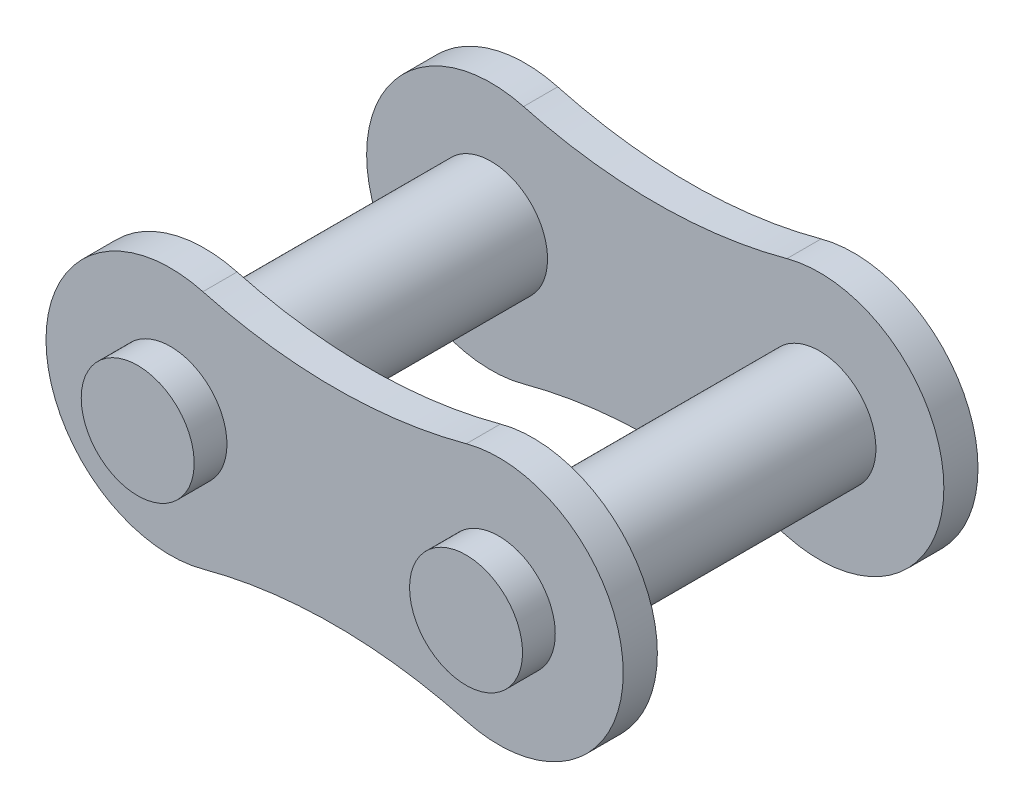
ISO-10303-21;
HEADER;
FILE_DESCRIPTION(('STEP AP214'),'2;1');
FILE_NAME('part.step','',(''),(''),'','','');
FILE_SCHEMA(('AUTOMOTIVE_DESIGN { 1 0 10303 214 1 1 1 1 }'));
ENDSEC;
DATA;
#1=APPLICATION_CONTEXT('core data for automotive mechanical design processes');
#2=APPLICATION_PROTOCOL_DEFINITION('international standard','automotive_design',2000,#1);
#3=PRODUCT_CONTEXT('',#1,'mechanical');
#4=PRODUCT('Part','Part','',(#3));
#5=PRODUCT_RELATED_PRODUCT_CATEGORY('part','',(#4));
#6=PRODUCT_DEFINITION_FORMATION('','',#4);
#7=PRODUCT_DEFINITION_CONTEXT('part definition',#1,'design');
#8=PRODUCT_DEFINITION('design','',#6,#7);
#9=PRODUCT_DEFINITION_SHAPE('','',#8);
#10=(LENGTH_UNIT() NAMED_UNIT(*) SI_UNIT(.MILLI.,.METRE.));
#11=(NAMED_UNIT(*) PLANE_ANGLE_UNIT() SI_UNIT($,.RADIAN.));
#12=(NAMED_UNIT(*) SI_UNIT($,.STERADIAN.) SOLID_ANGLE_UNIT());
#13=UNCERTAINTY_MEASURE_WITH_UNIT(LENGTH_MEASURE(1.E-05),#10,'distance_accuracy_value','');
#14=(GEOMETRIC_REPRESENTATION_CONTEXT(3) GLOBAL_UNCERTAINTY_ASSIGNED_CONTEXT((#13)) GLOBAL_UNIT_ASSIGNED_CONTEXT((#10,
#11,#12)) REPRESENTATION_CONTEXT('',''));
#15=CARTESIAN_POINT('',(0.,0.,0.));
#16=DIRECTION('',(0.,0.,1.));
#17=DIRECTION('',(1.,0.,0.));
#18=AXIS2_PLACEMENT_3D('',#15,#16,#17);
#19=CARTESIAN_POINT('',(14.2875,0.,6.096));
#20=DIRECTION('',(0.,0.,-1.));
#21=DIRECTION('',(-1.,0.,0.));
#22=AXIS2_PLACEMENT_3D('',#19,#20,#21);
#23=CYLINDRICAL_SURFACE('',#22,1.6383);
#24=CARTESIAN_POINT('',(14.2875,0.,6.096));
#25=DIRECTION('',(0.,0.,1.));
#26=DIRECTION('',(1.,0.,0.));
#27=AXIS2_PLACEMENT_3D('',#24,#25,#26);
#28=CIRCLE('',#27,1.6383);
#29=CARTESIAN_POINT('',(12.6492,0.,6.096));
#30=VERTEX_POINT('',#29);
#31=EDGE_CURVE('E11',#30,#30,#28,.T.);
#32=CARTESIAN_POINT('',(14.2875,0.,-6.096));
#33=DIRECTION('',(0.,0.,1.));
#34=DIRECTION('',(1.,0.,0.));
#35=AXIS2_PLACEMENT_3D('',#32,#33,#34);
#36=CIRCLE('',#35,1.6383);
#37=CARTESIAN_POINT('',(12.6492,0.,-6.096));
#38=VERTEX_POINT('',#37);
#39=EDGE_CURVE('E49',#38,#38,#36,.T.);
#40=CARTESIAN_POINT('',(12.6492,0.,6.096));
#41=CARTESIAN_POINT('',(12.6492,0.,5.969));
#42=CARTESIAN_POINT('',(12.6492,0.,5.842));
#43=CARTESIAN_POINT('',(12.6492,0.,5.588));
#44=CARTESIAN_POINT('',(12.6492,0.,5.461));
#45=CARTESIAN_POINT('',(12.6492,0.,5.207));
#46=CARTESIAN_POINT('',(12.6492,0.,5.08));
#47=CARTESIAN_POINT('',(12.6492,0.,4.826));
#48=CARTESIAN_POINT('',(12.6492,0.,4.699));
#49=CARTESIAN_POINT('',(12.6492,0.,4.445));
#50=CARTESIAN_POINT('',(12.6492,0.,4.318));
#51=CARTESIAN_POINT('',(12.6492,0.,4.064));
#52=CARTESIAN_POINT('',(12.6492,0.,3.937));
#53=CARTESIAN_POINT('',(12.6492,0.,3.683));
#54=CARTESIAN_POINT('',(12.6492,0.,3.556));
#55=CARTESIAN_POINT('',(12.6492,0.,3.302));
#56=CARTESIAN_POINT('',(12.6492,0.,3.175));
#57=CARTESIAN_POINT('',(12.6492,0.,2.921));
#58=CARTESIAN_POINT('',(12.6492,0.,2.794));
#59=CARTESIAN_POINT('',(12.6492,0.,2.54));
#60=CARTESIAN_POINT('',(12.6492,0.,2.413));
#61=CARTESIAN_POINT('',(12.6492,0.,2.159));
#62=CARTESIAN_POINT('',(12.6492,0.,2.032));
#63=CARTESIAN_POINT('',(12.6492,0.,1.778));
#64=CARTESIAN_POINT('',(12.6492,0.,1.651));
#65=CARTESIAN_POINT('',(12.6492,0.,1.397));
#66=CARTESIAN_POINT('',(12.6492,0.,1.27));
#67=CARTESIAN_POINT('',(12.6492,0.,1.016));
#68=CARTESIAN_POINT('',(12.6492,0.,0.888999999999999));
#69=CARTESIAN_POINT('',(12.6492,0.,0.635));
#70=CARTESIAN_POINT('',(12.6492,0.,0.507999999999999));
#71=CARTESIAN_POINT('',(12.6492,0.,0.253999999999999));
#72=CARTESIAN_POINT('',(12.6492,0.,0.126999999999999));
#73=CARTESIAN_POINT('',(12.6492,0.,-0.127000000000001));
#74=CARTESIAN_POINT('',(12.6492,0.,-0.254000000000001));
#75=CARTESIAN_POINT('',(12.6492,0.,-0.508000000000001));
#76=CARTESIAN_POINT('',(12.6492,0.,-0.635000000000001));
#77=CARTESIAN_POINT('',(12.6492,0.,-0.889000000000001));
#78=CARTESIAN_POINT('',(12.6492,0.,-1.016));
#79=CARTESIAN_POINT('',(12.6492,0.,-1.27));
#80=CARTESIAN_POINT('',(12.6492,0.,-1.397));
#81=CARTESIAN_POINT('',(12.6492,0.,-1.651));
#82=CARTESIAN_POINT('',(12.6492,0.,-1.778));
#83=CARTESIAN_POINT('',(12.6492,0.,-2.032));
#84=CARTESIAN_POINT('',(12.6492,0.,-2.159));
#85=CARTESIAN_POINT('',(12.6492,0.,-2.413));
#86=CARTESIAN_POINT('',(12.6492,0.,-2.54));
#87=CARTESIAN_POINT('',(12.6492,0.,-2.794));
#88=CARTESIAN_POINT('',(12.6492,0.,-2.921));
#89=CARTESIAN_POINT('',(12.6492,0.,-3.175));
#90=CARTESIAN_POINT('',(12.6492,0.,-3.302));
#91=CARTESIAN_POINT('',(12.6492,0.,-3.556));
#92=CARTESIAN_POINT('',(12.6492,0.,-3.683));
#93=CARTESIAN_POINT('',(12.6492,0.,-3.937));
#94=CARTESIAN_POINT('',(12.6492,0.,-4.064));
#95=CARTESIAN_POINT('',(12.6492,0.,-4.318));
#96=CARTESIAN_POINT('',(12.6492,0.,-4.445));
#97=CARTESIAN_POINT('',(12.6492,0.,-4.699));
#98=CARTESIAN_POINT('',(12.6492,0.,-4.826));
#99=CARTESIAN_POINT('',(12.6492,0.,-5.08));
#100=CARTESIAN_POINT('',(12.6492,0.,-5.207));
#101=CARTESIAN_POINT('',(12.6492,0.,-5.461));
#102=CARTESIAN_POINT('',(12.6492,0.,-5.588));
#103=CARTESIAN_POINT('',(12.6492,0.,-5.842));
#104=CARTESIAN_POINT('',(12.6492,0.,-5.969));
#105=CARTESIAN_POINT('',(12.6492,0.,-6.096));
#106=B_SPLINE_CURVE_WITH_KNOTS('',3,(#40,#41,#42,#43,#44,#45,#46,#47,#48,#49,#50,#51,#52,#53,
#54,#55,#56,#57,#58,#59,#60,#61,#62,#63,#64,#65,#66,#67,#68,#69,#70,#71,#72,#73,#74,#75,#76,#77,
#78,#79,#80,#81,#82,#83,#84,#85,#86,#87,#88,#89,#90,#91,#92,#93,#94,#95,#96,#97,#98,#99,#100,
#101,#102,#103,#104,#105),.UNSPECIFIED.,.F.,.F.,(4,2,2,2,2,2,2,2,2,2,2,2,2,2,2,2,2,2,2,2,2,2,2,
2,2,2,2,2,2,2,2,2,4),(0.,0.380999999999999,0.762,1.143,1.524,1.905,2.286,2.667,3.048,3.429,3.81,
4.191,4.572,4.953,5.334,5.715,6.096,6.477,6.858,7.239,7.62,8.001,8.382,8.763,9.144,9.525,9.906,
10.287,10.668,11.049,11.43,11.811,12.192),.UNSPECIFIED.);
#107=EDGE_CURVE('BSEAM43',#30,#38,#106,.T.);
#108=ORIENTED_EDGE('',*,*,#31,.F.);
#109=ORIENTED_EDGE('',*,*,#39,.T.);
#110=ORIENTED_EDGE('',*,*,#107,.T.);
#111=ORIENTED_EDGE('',*,*,#107,.F.);
#112=EDGE_LOOP('',(#108,#110,#109,#111));
#113=FACE_BOUND('',#112,.T.);
#114=ADVANCED_FACE('F43',(#113),#23,.T.);
#115=CARTESIAN_POINT('',(14.2875,0.,6.096));
#116=DIRECTION('',(0.,0.,1.));
#117=DIRECTION('',(1.,0.,0.));
#118=AXIS2_PLACEMENT_3D('',#115,#116,#117);
#119=PLANE('',#118);
#120=ORIENTED_EDGE('',*,*,#31,.T.);
#121=EDGE_LOOP('',(#120));
#122=FACE_BOUND('',#121,.T.);
#123=ADVANCED_FACE('F58',(#122),#119,.T.);
#124=CARTESIAN_POINT('',(14.2875,0.,-6.096));
#125=DIRECTION('',(0.,0.,1.));
#126=DIRECTION('',(1.,0.,0.));
#127=AXIS2_PLACEMENT_3D('',#124,#125,#126);
#128=PLANE('',#127);
#129=ORIENTED_EDGE('',*,*,#39,.F.);
#130=EDGE_LOOP('',(#129));
#131=FACE_BOUND('',#130,.T.);
#132=ADVANCED_FACE('F56',(#131),#128,.F.);
#133=CLOSED_SHELL('',(#114,#123,#132));
#134=MANIFOLD_SOLID_BREP('B2',#133);
#135=CARTESIAN_POINT('',(4.7625,0.,6.096));
#136=DIRECTION('',(0.,0.,-1.));
#137=DIRECTION('',(-1.,0.,0.));
#138=AXIS2_PLACEMENT_3D('',#135,#136,#137);
#139=CYLINDRICAL_SURFACE('',#138,1.6383);
#140=CARTESIAN_POINT('',(4.7625,0.,6.096));
#141=DIRECTION('',(0.,0.,1.));
#142=DIRECTION('',(1.,0.,0.));
#143=AXIS2_PLACEMENT_3D('',#140,#141,#142);
#144=CIRCLE('',#143,1.6383);
#145=CARTESIAN_POINT('',(3.1242,0.,6.096));
#146=VERTEX_POINT('',#145);
#147=EDGE_CURVE('E42',#146,#146,#144,.T.);
#148=CARTESIAN_POINT('',(4.7625,0.,-6.096));
#149=DIRECTION('',(0.,0.,1.));
#150=DIRECTION('',(1.,0.,0.));
#151=AXIS2_PLACEMENT_3D('',#148,#149,#150);
#152=CIRCLE('',#151,1.6383);
#153=CARTESIAN_POINT('',(3.1242,0.,-6.096));
#154=VERTEX_POINT('',#153);
#155=EDGE_CURVE('E99',#154,#154,#152,.T.);
#156=CARTESIAN_POINT('',(3.1242,0.,6.096));
#157=CARTESIAN_POINT('',(3.1242,0.,5.969));
#158=CARTESIAN_POINT('',(3.1242,0.,5.842));
#159=CARTESIAN_POINT('',(3.1242,0.,5.588));
#160=CARTESIAN_POINT('',(3.1242,0.,5.461));
#161=CARTESIAN_POINT('',(3.1242,0.,5.207));
#162=CARTESIAN_POINT('',(3.1242,0.,5.08));
#163=CARTESIAN_POINT('',(3.1242,0.,4.826));
#164=CARTESIAN_POINT('',(3.1242,0.,4.699));
#165=CARTESIAN_POINT('',(3.1242,0.,4.445));
#166=CARTESIAN_POINT('',(3.1242,0.,4.318));
#167=CARTESIAN_POINT('',(3.1242,0.,4.064));
#168=CARTESIAN_POINT('',(3.1242,0.,3.937));
#169=CARTESIAN_POINT('',(3.1242,0.,3.683));
#170=CARTESIAN_POINT('',(3.1242,0.,3.556));
#171=CARTESIAN_POINT('',(3.1242,0.,3.302));
#172=CARTESIAN_POINT('',(3.1242,0.,3.175));
#173=CARTESIAN_POINT('',(3.1242,0.,2.921));
#174=CARTESIAN_POINT('',(3.1242,0.,2.794));
#175=CARTESIAN_POINT('',(3.1242,0.,2.54));
#176=CARTESIAN_POINT('',(3.1242,0.,2.413));
#177=CARTESIAN_POINT('',(3.1242,0.,2.159));
#178=CARTESIAN_POINT('',(3.1242,0.,2.032));
#179=CARTESIAN_POINT('',(3.1242,0.,1.778));
#180=CARTESIAN_POINT('',(3.1242,0.,1.651));
#181=CARTESIAN_POINT('',(3.1242,0.,1.397));
#182=CARTESIAN_POINT('',(3.1242,0.,1.27));
#183=CARTESIAN_POINT('',(3.1242,0.,1.016));
#184=CARTESIAN_POINT('',(3.1242,0.,0.888999999999999));
#185=CARTESIAN_POINT('',(3.1242,0.,0.635));
#186=CARTESIAN_POINT('',(3.1242,0.,0.507999999999999));
#187=CARTESIAN_POINT('',(3.1242,0.,0.253999999999999));
#188=CARTESIAN_POINT('',(3.1242,0.,0.126999999999999));
#189=CARTESIAN_POINT('',(3.1242,0.,-0.127000000000001));
#190=CARTESIAN_POINT('',(3.1242,0.,-0.254000000000001));
#191=CARTESIAN_POINT('',(3.1242,0.,-0.508000000000001));
#192=CARTESIAN_POINT('',(3.1242,0.,-0.635000000000001));
#193=CARTESIAN_POINT('',(3.1242,0.,-0.889000000000001));
#194=CARTESIAN_POINT('',(3.1242,0.,-1.016));
#195=CARTESIAN_POINT('',(3.1242,0.,-1.27));
#196=CARTESIAN_POINT('',(3.1242,0.,-1.397));
#197=CARTESIAN_POINT('',(3.1242,0.,-1.651));
#198=CARTESIAN_POINT('',(3.1242,0.,-1.778));
#199=CARTESIAN_POINT('',(3.1242,0.,-2.032));
#200=CARTESIAN_POINT('',(3.1242,0.,-2.159));
#201=CARTESIAN_POINT('',(3.1242,0.,-2.413));
#202=CARTESIAN_POINT('',(3.1242,0.,-2.54));
#203=CARTESIAN_POINT('',(3.1242,0.,-2.794));
#204=CARTESIAN_POINT('',(3.1242,0.,-2.921));
#205=CARTESIAN_POINT('',(3.1242,0.,-3.175));
#206=CARTESIAN_POINT('',(3.1242,0.,-3.302));
#207=CARTESIAN_POINT('',(3.1242,0.,-3.556));
#208=CARTESIAN_POINT('',(3.1242,0.,-3.683));
#209=CARTESIAN_POINT('',(3.1242,0.,-3.937));
#210=CARTESIAN_POINT('',(3.1242,0.,-4.064));
#211=CARTESIAN_POINT('',(3.1242,0.,-4.318));
#212=CARTESIAN_POINT('',(3.1242,0.,-4.445));
#213=CARTESIAN_POINT('',(3.1242,0.,-4.699));
#214=CARTESIAN_POINT('',(3.1242,0.,-4.826));
#215=CARTESIAN_POINT('',(3.1242,0.,-5.08));
#216=CARTESIAN_POINT('',(3.1242,0.,-5.207));
#217=CARTESIAN_POINT('',(3.1242,0.,-5.461));
#218=CARTESIAN_POINT('',(3.1242,0.,-5.588));
#219=CARTESIAN_POINT('',(3.1242,0.,-5.842));
#220=CARTESIAN_POINT('',(3.1242,0.,-5.969));
#221=CARTESIAN_POINT('',(3.1242,0.,-6.096));
#222=B_SPLINE_CURVE_WITH_KNOTS('',3,(#156,#157,#158,#159,#160,#161,#162,#163,#164,#165,#166,
#167,#168,#169,#170,#171,#172,#173,#174,#175,#176,#177,#178,#179,#180,#181,#182,#183,#184,#185,
#186,#187,#188,#189,#190,#191,#192,#193,#194,#195,#196,#197,#198,#199,#200,#201,#202,#203,#204,
#205,#206,#207,#208,#209,#210,#211,#212,#213,#214,#215,#216,#217,#218,#219,#220,#221),
.UNSPECIFIED.,.F.,.F.,(4,2,2,2,2,2,2,2,2,2,2,2,2,2,2,2,2,2,2,2,2,2,2,2,2,2,2,2,2,2,2,2,4),(0.,
0.380999999999999,0.762,1.143,1.524,1.905,2.286,2.667,3.048,3.429,3.81,4.191,4.572,4.953,5.334,
5.715,6.096,6.477,6.858,7.239,7.62,8.001,8.382,8.763,9.144,9.525,9.906,10.287,10.668,11.049,
11.43,11.811,12.192),.UNSPECIFIED.);
#223=EDGE_CURVE('BSEAM93',#146,#154,#222,.T.);
#224=ORIENTED_EDGE('',*,*,#147,.F.);
#225=ORIENTED_EDGE('',*,*,#155,.T.);
#226=ORIENTED_EDGE('',*,*,#223,.T.);
#227=ORIENTED_EDGE('',*,*,#223,.F.);
#228=EDGE_LOOP('',(#224,#226,#225,#227));
#229=FACE_BOUND('',#228,.T.);
#230=ADVANCED_FACE('F93',(#229),#139,.T.);
#231=CARTESIAN_POINT('',(4.7625,0.,6.096));
#232=DIRECTION('',(0.,0.,1.));
#233=DIRECTION('',(1.,0.,0.));
#234=AXIS2_PLACEMENT_3D('',#231,#232,#233);
#235=PLANE('',#234);
#236=ORIENTED_EDGE('',*,*,#147,.T.);
#237=EDGE_LOOP('',(#236));
#238=FACE_BOUND('',#237,.T.);
#239=ADVANCED_FACE('F108',(#238),#235,.T.);
#240=CARTESIAN_POINT('',(4.7625,0.,-6.096));
#241=DIRECTION('',(0.,0.,1.));
#242=DIRECTION('',(1.,0.,0.));
#243=AXIS2_PLACEMENT_3D('',#240,#241,#242);
#244=PLANE('',#243);
#245=ORIENTED_EDGE('',*,*,#155,.F.);
#246=EDGE_LOOP('',(#245));
#247=FACE_BOUND('',#246,.T.);
#248=ADVANCED_FACE('F106',(#247),#244,.F.);
#249=CLOSED_SHELL('',(#230,#239,#248));
#250=MANIFOLD_SOLID_BREP('B6',#249);
#251=CARTESIAN_POINT('',(9.525,17.6136300966276,5.146));
#252=DIRECTION('',(0.,0.,-1.));
#253=DIRECTION('',(1.,0.,0.));
#254=AXIS2_PLACEMENT_3D('',#251,#252,#253);
#255=CYLINDRICAL_SURFACE('',#254,14.6362850541796);
#256=CARTESIAN_POINT('',(9.525,17.6136300966276,4.1554));
#257=DIRECTION('',(0.,0.,-1.));
#258=DIRECTION('',(1.,0.,0.));
#259=AXIS2_PLACEMENT_3D('',#256,#257,#258);
#260=CIRCLE('',#259,14.6362850541796);
#261=CARTESIAN_POINT('',(13.3452783769881,3.48471246966415,4.1554));
#262=VERTEX_POINT('',#261);
#263=CARTESIAN_POINT('',(5.70472162301189,3.48471246966415,4.1554));
#264=VERTEX_POINT('',#263);
#265=EDGE_CURVE('E206',#262,#264,#260,.T.);
#266=ORIENTED_EDGE('',*,*,#265,.T.);
#267=DIRECTION('',(0.,0.,-1.));
#268=VECTOR('',#267,1.);
#269=CARTESIAN_POINT('',(5.70472162301189,3.48471246966415,5.146));
#270=LINE('',#269,#268);
#271=CARTESIAN_POINT('',(5.70472162301189,3.48471246966415,5.146));
#272=VERTEX_POINT('',#271);
#273=EDGE_CURVE('E145',#272,#264,#270,.T.);
#274=ORIENTED_EDGE('',*,*,#273,.F.);
#275=CARTESIAN_POINT('',(9.525,17.6136300966276,5.146));
#276=DIRECTION('',(0.,0.,-1.));
#277=DIRECTION('',(1.,0.,0.));
#278=AXIS2_PLACEMENT_3D('',#275,#276,#277);
#279=CIRCLE('',#278,14.6362850541796);
#280=CARTESIAN_POINT('',(13.3452783769881,3.48471246966415,5.146));
#281=VERTEX_POINT('',#280);
#282=EDGE_CURVE('E195',#281,#272,#279,.T.);
#283=ORIENTED_EDGE('',*,*,#282,.F.);
#284=DIRECTION('',(0.,0.,-1.));
#285=VECTOR('',#284,1.);
#286=CARTESIAN_POINT('',(13.3452783769881,3.48471246966415,5.146));
#287=LINE('',#286,#285);
#288=EDGE_CURVE('E91',#281,#262,#287,.T.);
#289=ORIENTED_EDGE('',*,*,#288,.T.);
#290=EDGE_LOOP('',(#266,#274,#283,#289));
#291=FACE_BOUND('',#290,.T.);
#292=ADVANCED_FACE('F142',(#291),#255,.F.);
#293=CARTESIAN_POINT('',(14.2875,0.,5.146));
#294=DIRECTION('',(0.,0.,-1.));
#295=DIRECTION('',(1.,0.,0.));
#296=AXIS2_PLACEMENT_3D('',#293,#294,#295);
#297=CYLINDRICAL_SURFACE('',#296,3.609848);
#298=CARTESIAN_POINT('',(14.2875,0.,4.1554));
#299=DIRECTION('',(0.,0.,1.));
#300=DIRECTION('',(1.,0.,0.));
#301=AXIS2_PLACEMENT_3D('',#298,#299,#300);
#302=CIRCLE('',#301,3.609848);
#303=CARTESIAN_POINT('',(13.3452783769881,-3.48471246966415,4.1554));
#304=VERTEX_POINT('',#303);
#305=EDGE_CURVE('E183',#304,#262,#302,.T.);
#306=ORIENTED_EDGE('',*,*,#305,.T.);
#307=ORIENTED_EDGE('',*,*,#288,.F.);
#308=CARTESIAN_POINT('',(14.2875,0.,5.146));
#309=DIRECTION('',(0.,0.,1.));
#310=DIRECTION('',(1.,0.,0.));
#311=AXIS2_PLACEMENT_3D('',#308,#309,#310);
#312=CIRCLE('',#311,3.609848);
#313=CARTESIAN_POINT('',(13.3452783769881,-3.48471246966415,5.146));
#314=VERTEX_POINT('',#313);
#315=EDGE_CURVE('E160',#314,#281,#312,.T.);
#316=ORIENTED_EDGE('',*,*,#315,.F.);
#317=DIRECTION('',(0.,0.,-1.));
#318=VECTOR('',#317,1.);
#319=CARTESIAN_POINT('',(13.3452783769881,-3.48471246966415,5.146));
#320=LINE('',#319,#318);
#321=EDGE_CURVE('E151',#314,#304,#320,.T.);
#322=ORIENTED_EDGE('',*,*,#321,.T.);
#323=EDGE_LOOP('',(#306,#307,#316,#322));
#324=FACE_BOUND('',#323,.T.);
#325=ADVANCED_FACE('F213',(#324),#297,.T.);
#326=CARTESIAN_POINT('',(9.525,-17.6136300966276,5.146));
#327=DIRECTION('',(0.,0.,-1.));
#328=DIRECTION('',(1.,0.,0.));
#329=AXIS2_PLACEMENT_3D('',#326,#327,#328);
#330=CYLINDRICAL_SURFACE('',#329,14.6362850541796);
#331=CARTESIAN_POINT('',(9.525,-17.6136300966276,4.1554));
#332=DIRECTION('',(0.,0.,-1.));
#333=DIRECTION('',(-1.,0.,0.));
#334=AXIS2_PLACEMENT_3D('',#331,#332,#333);
#335=CIRCLE('',#334,14.6362850541796);
#336=CARTESIAN_POINT('',(5.70472162301189,-3.48471246966415,4.1554));
#337=VERTEX_POINT('',#336);
#338=EDGE_CURVE('E177',#337,#304,#335,.T.);
#339=ORIENTED_EDGE('',*,*,#338,.T.);
#340=ORIENTED_EDGE('',*,*,#321,.F.);
#341=CARTESIAN_POINT('',(9.525,-17.6136300966276,5.146));
#342=DIRECTION('',(0.,0.,-1.));
#343=DIRECTION('',(-1.,0.,0.));
#344=AXIS2_PLACEMENT_3D('',#341,#342,#343);
#345=CIRCLE('',#344,14.6362850541796);
#346=CARTESIAN_POINT('',(5.70472162301189,-3.48471246966415,5.146));
#347=VERTEX_POINT('',#346);
#348=EDGE_CURVE('E193',#347,#314,#345,.T.);
#349=ORIENTED_EDGE('',*,*,#348,.F.);
#350=DIRECTION('',(0.,0.,-1.));
#351=VECTOR('',#350,1.);
#352=CARTESIAN_POINT('',(5.70472162301189,-3.48471246966415,5.146));
#353=LINE('',#352,#351);
#354=EDGE_CURVE('E198',#347,#337,#353,.T.);
#355=ORIENTED_EDGE('',*,*,#354,.T.);
#356=EDGE_LOOP('',(#339,#340,#349,#355));
#357=FACE_BOUND('',#356,.T.);
#358=ADVANCED_FACE('F201',(#357),#330,.F.);
#359=CARTESIAN_POINT('',(4.7625,0.,5.146));
#360=DIRECTION('',(0.,0.,-1.));
#361=DIRECTION('',(1.,0.,0.));
#362=AXIS2_PLACEMENT_3D('',#359,#360,#361);
#363=CYLINDRICAL_SURFACE('',#362,3.609848);
#364=CARTESIAN_POINT('',(4.7625,0.,4.1554));
#365=DIRECTION('',(0.,0.,1.));
#366=DIRECTION('',(1.,0.,0.));
#367=AXIS2_PLACEMENT_3D('',#364,#365,#366);
#368=CIRCLE('',#367,3.609848);
#369=EDGE_CURVE('E200',#264,#337,#368,.T.);
#370=ORIENTED_EDGE('',*,*,#369,.T.);
#371=ORIENTED_EDGE('',*,*,#354,.F.);
#372=CARTESIAN_POINT('',(4.7625,0.,5.146));
#373=DIRECTION('',(0.,0.,1.));
#374=DIRECTION('',(1.,0.,0.));
#375=AXIS2_PLACEMENT_3D('',#372,#373,#374);
#376=CIRCLE('',#375,3.609848);
#377=EDGE_CURVE('E190',#272,#347,#376,.T.);
#378=ORIENTED_EDGE('',*,*,#377,.F.);
#379=ORIENTED_EDGE('',*,*,#273,.T.);
#380=EDGE_LOOP('',(#370,#371,#378,#379));
#381=FACE_BOUND('',#380,.T.);
#382=ADVANCED_FACE('F199',(#381),#363,.T.);
#383=CARTESIAN_POINT('',(11.90625,8.80681504831378,5.146));
#384=DIRECTION('',(0.,0.,-1.));
#385=DIRECTION('',(1.,0.,0.));
#386=AXIS2_PLACEMENT_3D('',#383,#384,#385);
#387=PLANE('',#386);
#388=CARTESIAN_POINT('',(14.2875,0.,5.146));
#389=DIRECTION('',(0.,0.,1.));
#390=DIRECTION('',(1.,0.,0.));
#391=AXIS2_PLACEMENT_3D('',#388,#389,#390);
#392=CIRCLE('',#391,1.6383);
#393=CARTESIAN_POINT('',(15.9258,0.,5.146));
#394=VERTEX_POINT('',#393);
#395=EDGE_CURVE('E222',#394,#394,#392,.T.);
#396=ORIENTED_EDGE('',*,*,#395,.F.);
#397=EDGE_LOOP('',(#396));
#398=FACE_BOUND('',#397,.T.);
#399=CARTESIAN_POINT('',(4.7625,0.,5.146));
#400=DIRECTION('',(0.,0.,1.));
#401=DIRECTION('',(1.,0.,0.));
#402=AXIS2_PLACEMENT_3D('',#399,#400,#401);
#403=CIRCLE('',#402,1.6383);
#404=CARTESIAN_POINT('',(6.4008,0.,5.146));
#405=VERTEX_POINT('',#404);
#406=EDGE_CURVE('E209',#405,#405,#403,.T.);
#407=ORIENTED_EDGE('',*,*,#406,.F.);
#408=EDGE_LOOP('',(#407));
#409=FACE_BOUND('',#408,.T.);
#410=ORIENTED_EDGE('',*,*,#282,.T.);
#411=ORIENTED_EDGE('',*,*,#377,.T.);
#412=ORIENTED_EDGE('',*,*,#348,.T.);
#413=ORIENTED_EDGE('',*,*,#315,.T.);
#414=EDGE_LOOP('',(#410,#411,#412,#413));
#415=FACE_BOUND('',#414,.T.);
#416=ADVANCED_FACE('F191',(#398,#409,#415),#387,.F.);
#417=CARTESIAN_POINT('',(11.90625,8.80681504831378,4.1554));
#418=DIRECTION('',(0.,0.,-1.));
#419=DIRECTION('',(1.,0.,0.));
#420=AXIS2_PLACEMENT_3D('',#417,#418,#419);
#421=PLANE('',#420);
#422=CARTESIAN_POINT('',(14.2875,0.,4.1554));
#423=DIRECTION('',(0.,0.,1.));
#424=DIRECTION('',(1.,0.,0.));
#425=AXIS2_PLACEMENT_3D('',#422,#423,#424);
#426=CIRCLE('',#425,1.6383);
#427=CARTESIAN_POINT('',(15.9258,0.,4.1554));
#428=VERTEX_POINT('',#427);
#429=EDGE_CURVE('E225',#428,#428,#426,.T.);
#430=ORIENTED_EDGE('',*,*,#429,.T.);
#431=EDGE_LOOP('',(#430));
#432=FACE_BOUND('',#431,.T.);
#433=CARTESIAN_POINT('',(4.7625,0.,4.1554));
#434=DIRECTION('',(0.,0.,1.));
#435=DIRECTION('',(1.,0.,0.));
#436=AXIS2_PLACEMENT_3D('',#433,#434,#435);
#437=CIRCLE('',#436,1.6383);
#438=CARTESIAN_POINT('',(6.4008,0.,4.1554));
#439=VERTEX_POINT('',#438);
#440=EDGE_CURVE('E219',#439,#439,#437,.T.);
#441=ORIENTED_EDGE('',*,*,#440,.T.);
#442=EDGE_LOOP('',(#441));
#443=FACE_BOUND('',#442,.T.);
#444=ORIENTED_EDGE('',*,*,#265,.F.);
#445=ORIENTED_EDGE('',*,*,#305,.F.);
#446=ORIENTED_EDGE('',*,*,#338,.F.);
#447=ORIENTED_EDGE('',*,*,#369,.F.);
#448=EDGE_LOOP('',(#444,#445,#446,#447));
#449=FACE_BOUND('',#448,.T.);
#450=ADVANCED_FACE('F216',(#432,#443,#449),#421,.T.);
#451=CARTESIAN_POINT('',(4.7625,0.,5.146));
#452=DIRECTION('',(0.,0.,-1.));
#453=DIRECTION('',(1.,0.,0.));
#454=AXIS2_PLACEMENT_3D('',#451,#452,#453);
#455=CYLINDRICAL_SURFACE('',#454,1.6383);
#456=ORIENTED_EDGE('',*,*,#406,.T.);
#457=EDGE_LOOP('',(#456));
#458=FACE_BOUND('',#457,.T.);
#459=ORIENTED_EDGE('',*,*,#440,.F.);
#460=EDGE_LOOP('',(#459));
#461=FACE_BOUND('',#460,.T.);
#462=ADVANCED_FACE('F239',(#458,#461),#455,.F.);
#463=CARTESIAN_POINT('',(14.2875,0.,5.146));
#464=DIRECTION('',(0.,0.,-1.));
#465=DIRECTION('',(1.,0.,0.));
#466=AXIS2_PLACEMENT_3D('',#463,#464,#465);
#467=CYLINDRICAL_SURFACE('',#466,1.6383);
#468=ORIENTED_EDGE('',*,*,#395,.T.);
#469=EDGE_LOOP('',(#468));
#470=FACE_BOUND('',#469,.T.);
#471=ORIENTED_EDGE('',*,*,#429,.F.);
#472=EDGE_LOOP('',(#471));
#473=FACE_BOUND('',#472,.T.);
#474=ADVANCED_FACE('F231',(#470,#473),#467,.F.);
#475=CLOSED_SHELL('',(#292,#325,#358,#382,#416,#450,#462,#474));
#476=MANIFOLD_SOLID_BREP('B37',#475);
#477=CARTESIAN_POINT('',(9.525,17.6136300966276,-5.146));
#478=DIRECTION('',(0.,0.,1.));
#479=DIRECTION('',(1.,0.,0.));
#480=AXIS2_PLACEMENT_3D('',#477,#478,#479);
#481=CYLINDRICAL_SURFACE('',#480,14.6362850541796);
#482=CARTESIAN_POINT('',(9.525,17.6136300966276,-4.1554));
#483=DIRECTION('',(0.,0.,-1.));
#484=DIRECTION('',(1.,0.,0.));
#485=AXIS2_PLACEMENT_3D('',#482,#483,#484);
#486=CIRCLE('',#485,14.6362850541796);
#487=CARTESIAN_POINT('',(13.3452783769881,3.48471246966415,-4.1554));
#488=VERTEX_POINT('',#487);
#489=CARTESIAN_POINT('',(5.70472162301189,3.48471246966415,-4.1554));
#490=VERTEX_POINT('',#489);
#491=EDGE_CURVE('E372',#488,#490,#486,.T.);
#492=ORIENTED_EDGE('',*,*,#491,.F.);
#493=DIRECTION('',(0.,0.,1.));
#494=VECTOR('',#493,1.);
#495=CARTESIAN_POINT('',(13.3452783769881,3.48471246966415,-5.146));
#496=LINE('',#495,#494);
#497=CARTESIAN_POINT('',(13.3452783769881,3.48471246966415,-5.146));
#498=VERTEX_POINT('',#497);
#499=EDGE_CURVE('E140',#498,#488,#496,.T.);
#500=ORIENTED_EDGE('',*,*,#499,.F.);
#501=CARTESIAN_POINT('',(9.525,17.6136300966276,-5.146));
#502=DIRECTION('',(0.,0.,-1.));
#503=DIRECTION('',(1.,0.,0.));
#504=AXIS2_PLACEMENT_3D('',#501,#502,#503);
#505=CIRCLE('',#504,14.6362850541796);
#506=CARTESIAN_POINT('',(5.70472162301189,3.48471246966415,-5.146));
#507=VERTEX_POINT('',#506);
#508=EDGE_CURVE('E365',#498,#507,#505,.T.);
#509=ORIENTED_EDGE('',*,*,#508,.T.);
#510=DIRECTION('',(0.,0.,1.));
#511=VECTOR('',#510,1.);
#512=CARTESIAN_POINT('',(5.70472162301189,3.48471246966415,-5.146));
#513=LINE('',#512,#511);
#514=EDGE_CURVE('E310',#507,#490,#513,.T.);
#515=ORIENTED_EDGE('',*,*,#514,.T.);
#516=EDGE_LOOP('',(#492,#500,#509,#515));
#517=FACE_BOUND('',#516,.T.);
#518=ADVANCED_FACE('F307',(#517),#481,.F.);
#519=CARTESIAN_POINT('',(14.2875,0.,-5.146));
#520=DIRECTION('',(0.,0.,1.));
#521=DIRECTION('',(1.,0.,0.));
#522=AXIS2_PLACEMENT_3D('',#519,#520,#521);
#523=CYLINDRICAL_SURFACE('',#522,3.609848);
#524=CARTESIAN_POINT('',(14.2875,0.,-4.1554));
#525=DIRECTION('',(0.,0.,1.));
#526=DIRECTION('',(1.,0.,0.));
#527=AXIS2_PLACEMENT_3D('',#524,#525,#526);
#528=CIRCLE('',#527,3.609848);
#529=CARTESIAN_POINT('',(13.3452783769881,-3.48471246966415,-4.1554));
#530=VERTEX_POINT('',#529);
#531=EDGE_CURVE('E367',#530,#488,#528,.T.);
#532=ORIENTED_EDGE('',*,*,#531,.F.);
#533=DIRECTION('',(0.,0.,1.));
#534=VECTOR('',#533,1.);
#535=CARTESIAN_POINT('',(13.3452783769881,-3.48471246966415,-5.146));
#536=LINE('',#535,#534);
#537=CARTESIAN_POINT('',(13.3452783769881,-3.48471246966415,-5.146));
#538=VERTEX_POINT('',#537);
#539=EDGE_CURVE('E316',#538,#530,#536,.T.);
#540=ORIENTED_EDGE('',*,*,#539,.F.);
#541=CARTESIAN_POINT('',(14.2875,0.,-5.146));
#542=DIRECTION('',(0.,0.,1.));
#543=DIRECTION('',(1.,0.,0.));
#544=AXIS2_PLACEMENT_3D('',#541,#542,#543);
#545=CIRCLE('',#544,3.609848);
#546=EDGE_CURVE('E362',#538,#498,#545,.T.);
#547=ORIENTED_EDGE('',*,*,#546,.T.);
#548=ORIENTED_EDGE('',*,*,#499,.T.);
#549=EDGE_LOOP('',(#532,#540,#547,#548));
#550=FACE_BOUND('',#549,.T.);
#551=ADVANCED_FACE('F383',(#550),#523,.T.);
#552=CARTESIAN_POINT('',(9.525,-17.6136300966276,-5.146));
#553=DIRECTION('',(0.,0.,1.));
#554=DIRECTION('',(1.,0.,0.));
#555=AXIS2_PLACEMENT_3D('',#552,#553,#554);
#556=CYLINDRICAL_SURFACE('',#555,14.6362850541796);
#557=CARTESIAN_POINT('',(9.525,-17.6136300966276,-4.1554));
#558=DIRECTION('',(0.,0.,-1.));
#559=DIRECTION('',(-1.,0.,0.));
#560=AXIS2_PLACEMENT_3D('',#557,#558,#559);
#561=CIRCLE('',#560,14.6362850541796);
#562=CARTESIAN_POINT('',(5.70472162301189,-3.48471246966415,-4.1554));
#563=VERTEX_POINT('',#562);
#564=EDGE_CURVE('E357',#563,#530,#561,.T.);
#565=ORIENTED_EDGE('',*,*,#564,.F.);
#566=DIRECTION('',(0.,0.,1.));
#567=VECTOR('',#566,1.);
#568=CARTESIAN_POINT('',(5.70472162301189,-3.48471246966415,-5.146));
#569=LINE('',#568,#567);
#570=CARTESIAN_POINT('',(5.70472162301189,-3.48471246966415,-5.146));
#571=VERTEX_POINT('',#570);
#572=EDGE_CURVE('E352',#571,#563,#569,.T.);
#573=ORIENTED_EDGE('',*,*,#572,.F.);
#574=CARTESIAN_POINT('',(9.525,-17.6136300966276,-5.146));
#575=DIRECTION('',(0.,0.,-1.));
#576=DIRECTION('',(-1.,0.,0.));
#577=AXIS2_PLACEMENT_3D('',#574,#575,#576);
#578=CIRCLE('',#577,14.6362850541796);
#579=EDGE_CURVE('E355',#571,#538,#578,.T.);
#580=ORIENTED_EDGE('',*,*,#579,.T.);
#581=ORIENTED_EDGE('',*,*,#539,.T.);
#582=EDGE_LOOP('',(#565,#573,#580,#581));
#583=FACE_BOUND('',#582,.T.);
#584=ADVANCED_FACE('F354',(#583),#556,.F.);
#585=CARTESIAN_POINT('',(4.7625,0.,-5.146));
#586=DIRECTION('',(0.,0.,1.));
#587=DIRECTION('',(1.,0.,0.));
#588=AXIS2_PLACEMENT_3D('',#585,#586,#587);
#589=CYLINDRICAL_SURFACE('',#588,3.609848);
#590=CARTESIAN_POINT('',(4.7625,0.,-4.1554));
#591=DIRECTION('',(0.,0.,1.));
#592=DIRECTION('',(1.,0.,0.));
#593=AXIS2_PLACEMENT_3D('',#590,#591,#592);
#594=CIRCLE('',#593,3.609848);
#595=EDGE_CURVE('E375',#490,#563,#594,.T.);
#596=ORIENTED_EDGE('',*,*,#595,.F.);
#597=ORIENTED_EDGE('',*,*,#514,.F.);
#598=CARTESIAN_POINT('',(4.7625,0.,-5.146));
#599=DIRECTION('',(0.,0.,1.));
#600=DIRECTION('',(1.,0.,0.));
#601=AXIS2_PLACEMENT_3D('',#598,#599,#600);
#602=CIRCLE('',#601,3.609848);
#603=EDGE_CURVE('E361',#507,#571,#602,.T.);
#604=ORIENTED_EDGE('',*,*,#603,.T.);
#605=ORIENTED_EDGE('',*,*,#572,.T.);
#606=EDGE_LOOP('',(#596,#597,#604,#605));
#607=FACE_BOUND('',#606,.T.);
#608=ADVANCED_FACE('F364',(#607),#589,.T.);
#609=CARTESIAN_POINT('',(11.90625,8.80681504831378,-5.146));
#610=DIRECTION('',(0.,0.,1.));
#611=DIRECTION('',(1.,0.,0.));
#612=AXIS2_PLACEMENT_3D('',#609,#610,#611);
#613=PLANE('',#612);
#614=CARTESIAN_POINT('',(14.2875,0.,-5.146));
#615=DIRECTION('',(0.,0.,1.));
#616=DIRECTION('',(1.,0.,0.));
#617=AXIS2_PLACEMENT_3D('',#614,#615,#616);
#618=CIRCLE('',#617,1.6383);
#619=CARTESIAN_POINT('',(15.9258,0.,-5.146));
#620=VERTEX_POINT('',#619);
#621=EDGE_CURVE('E416',#620,#620,#618,.T.);
#622=ORIENTED_EDGE('',*,*,#621,.T.);
#623=EDGE_LOOP('',(#622));
#624=FACE_BOUND('',#623,.T.);
#625=CARTESIAN_POINT('',(4.7625,0.,-5.146));
#626=DIRECTION('',(0.,0.,1.));
#627=DIRECTION('',(1.,0.,0.));
#628=AXIS2_PLACEMENT_3D('',#625,#626,#627);
#629=CIRCLE('',#628,1.6383);
#630=CARTESIAN_POINT('',(6.4008,0.,-5.146));
#631=VERTEX_POINT('',#630);
#632=EDGE_CURVE('E376',#631,#631,#629,.T.);
#633=ORIENTED_EDGE('',*,*,#632,.T.);
#634=EDGE_LOOP('',(#633));
#635=FACE_BOUND('',#634,.T.);
#636=ORIENTED_EDGE('',*,*,#508,.F.);
#637=ORIENTED_EDGE('',*,*,#546,.F.);
#638=ORIENTED_EDGE('',*,*,#579,.F.);
#639=ORIENTED_EDGE('',*,*,#603,.F.);
#640=EDGE_LOOP('',(#636,#637,#638,#639));
#641=FACE_BOUND('',#640,.T.);
#642=ADVANCED_FACE('F360',(#624,#635,#641),#613,.F.);
#643=CARTESIAN_POINT('',(11.90625,8.80681504831378,-4.1554));
#644=DIRECTION('',(0.,0.,1.));
#645=DIRECTION('',(1.,0.,0.));
#646=AXIS2_PLACEMENT_3D('',#643,#644,#645);
#647=PLANE('',#646);
#648=CARTESIAN_POINT('',(14.2875,0.,-4.1554));
#649=DIRECTION('',(0.,0.,1.));
#650=DIRECTION('',(1.,0.,0.));
#651=AXIS2_PLACEMENT_3D('',#648,#649,#650);
#652=CIRCLE('',#651,1.6383);
#653=CARTESIAN_POINT('',(15.9258,0.,-4.1554));
#654=VERTEX_POINT('',#653);
#655=EDGE_CURVE('E419',#654,#654,#652,.T.);
#656=ORIENTED_EDGE('',*,*,#655,.F.);
#657=EDGE_LOOP('',(#656));
#658=FACE_BOUND('',#657,.T.);
#659=CARTESIAN_POINT('',(4.7625,0.,-4.1554));
#660=DIRECTION('',(0.,0.,1.));
#661=DIRECTION('',(1.,0.,0.));
#662=AXIS2_PLACEMENT_3D('',#659,#660,#661);
#663=CIRCLE('',#662,1.6383);
#664=CARTESIAN_POINT('',(6.4008,0.,-4.1554));
#665=VERTEX_POINT('',#664);
#666=EDGE_CURVE('E421',#665,#665,#663,.T.);
#667=ORIENTED_EDGE('',*,*,#666,.F.);
#668=EDGE_LOOP('',(#667));
#669=FACE_BOUND('',#668,.T.);
#670=ORIENTED_EDGE('',*,*,#491,.T.);
#671=ORIENTED_EDGE('',*,*,#595,.T.);
#672=ORIENTED_EDGE('',*,*,#564,.T.);
#673=ORIENTED_EDGE('',*,*,#531,.T.);
#674=EDGE_LOOP('',(#670,#671,#672,#673));
#675=FACE_BOUND('',#674,.T.);
#676=ADVANCED_FACE('F382',(#658,#669,#675),#647,.T.);
#677=CARTESIAN_POINT('',(4.7625,0.,-5.146));
#678=DIRECTION('',(0.,0.,1.));
#679=DIRECTION('',(1.,0.,0.));
#680=AXIS2_PLACEMENT_3D('',#677,#678,#679);
#681=CYLINDRICAL_SURFACE('',#680,1.6383);
#682=ORIENTED_EDGE('',*,*,#632,.F.);
#683=EDGE_LOOP('',(#682));
#684=FACE_BOUND('',#683,.T.);
#685=ORIENTED_EDGE('',*,*,#666,.T.);
#686=EDGE_LOOP('',(#685));
#687=FACE_BOUND('',#686,.T.);
#688=ADVANCED_FACE('F401',(#684,#687),#681,.F.);
#689=CARTESIAN_POINT('',(14.2875,0.,-5.146));
#690=DIRECTION('',(0.,0.,1.));
#691=DIRECTION('',(1.,0.,0.));
#692=AXIS2_PLACEMENT_3D('',#689,#690,#691);
#693=CYLINDRICAL_SURFACE('',#692,1.6383);
#694=ORIENTED_EDGE('',*,*,#621,.F.);
#695=EDGE_LOOP('',(#694));
#696=FACE_BOUND('',#695,.T.);
#697=ORIENTED_EDGE('',*,*,#655,.T.);
#698=EDGE_LOOP('',(#697));
#699=FACE_BOUND('',#698,.T.);
#700=ADVANCED_FACE('F408',(#696,#699),#693,.F.);
#701=CLOSED_SHELL('',(#518,#551,#584,#608,#642,#676,#688,#700));
#702=MANIFOLD_SOLID_BREP('B85',#701);
#703=ADVANCED_BREP_SHAPE_REPRESENTATION('',(#18,#134,#250,#476,#702),#14);
#704=SHAPE_DEFINITION_REPRESENTATION(#9,#703);
ENDSEC;
END-ISO-10303-21;
